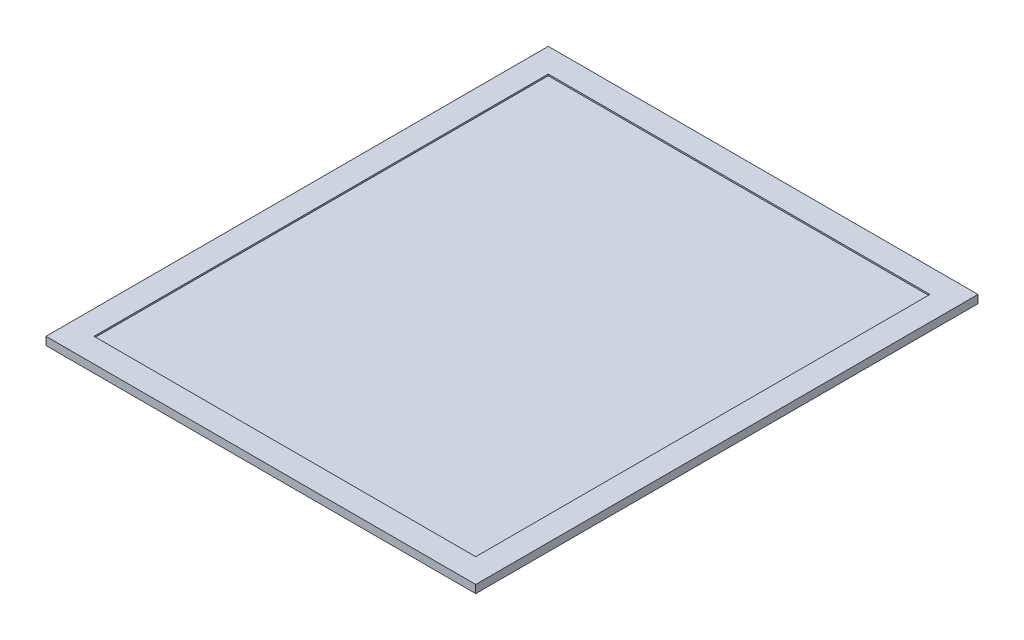
ISO-10303-21;
HEADER;
FILE_DESCRIPTION(('STEP AP214'),'2;1');
FILE_NAME('part.step','',(''),(''),'','','');
FILE_SCHEMA(('AUTOMOTIVE_DESIGN { 1 0 10303 214 1 1 1 1 }'));
ENDSEC;
DATA;
#1=APPLICATION_CONTEXT('core data for automotive mechanical design processes');
#2=APPLICATION_PROTOCOL_DEFINITION('international standard','automotive_design',2000,#1);
#3=PRODUCT_CONTEXT('',#1,'mechanical');
#4=PRODUCT('Part','Part','',(#3));
#5=PRODUCT_RELATED_PRODUCT_CATEGORY('part','',(#4));
#6=PRODUCT_DEFINITION_FORMATION('','',#4);
#7=PRODUCT_DEFINITION_CONTEXT('part definition',#1,'design');
#8=PRODUCT_DEFINITION('design','',#6,#7);
#9=PRODUCT_DEFINITION_SHAPE('','',#8);
#10=(LENGTH_UNIT() NAMED_UNIT(*) SI_UNIT(.MILLI.,.METRE.));
#11=(NAMED_UNIT(*) PLANE_ANGLE_UNIT() SI_UNIT($,.RADIAN.));
#12=(NAMED_UNIT(*) SI_UNIT($,.STERADIAN.) SOLID_ANGLE_UNIT());
#13=UNCERTAINTY_MEASURE_WITH_UNIT(LENGTH_MEASURE(1.E-05),#10,'distance_accuracy_value','');
#14=(GEOMETRIC_REPRESENTATION_CONTEXT(3) GLOBAL_UNCERTAINTY_ASSIGNED_CONTEXT((#13)) GLOBAL_UNIT_ASSIGNED_CONTEXT((#10,
#11,#12)) REPRESENTATION_CONTEXT('',''));
#15=CARTESIAN_POINT('',(0.,0.,0.));
#16=DIRECTION('',(0.,0.,1.));
#17=DIRECTION('',(1.,0.,0.));
#18=AXIS2_PLACEMENT_3D('',#15,#16,#17);
#19=CARTESIAN_POINT('',(192.5,-1084.5,1285.));
#20=DIRECTION('',(0.,1.,0.));
#21=DIRECTION('',(-1.,0.,0.));
#22=AXIS2_PLACEMENT_3D('',#19,#20,#21);
#23=PLANE('',#22);
#24=DIRECTION('',(1.,0.,0.));
#25=VECTOR('',#24,1.);
#26=CARTESIAN_POINT('',(-237.,-1084.5,1787.));
#27=LINE('',#26,#25);
#28=CARTESIAN_POINT('',(-237.,-1084.5,1787.));
#29=VERTEX_POINT('',#28);
#30=CARTESIAN_POINT('',(622.,-1084.5,1787.));
#31=VERTEX_POINT('',#30);
#32=EDGE_CURVE('E77',#29,#31,#27,.T.);
#33=ORIENTED_EDGE('',*,*,#32,.F.);
#34=DIRECTION('',(0.,0.,1.));
#35=VECTOR('',#34,1.);
#36=CARTESIAN_POINT('',(-237.,-1084.5,783.));
#37=LINE('',#36,#35);
#38=CARTESIAN_POINT('',(-237.,-1084.5,783.));
#39=VERTEX_POINT('',#38);
#40=EDGE_CURVE('E36',#39,#29,#37,.T.);
#41=ORIENTED_EDGE('',*,*,#40,.F.);
#42=DIRECTION('',(-1.,0.,0.));
#43=VECTOR('',#42,1.);
#44=CARTESIAN_POINT('',(622.,-1084.5,783.));
#45=LINE('',#44,#43);
#46=CARTESIAN_POINT('',(622.,-1084.5,783.));
#47=VERTEX_POINT('',#46);
#48=EDGE_CURVE('E81',#47,#39,#45,.T.);
#49=ORIENTED_EDGE('',*,*,#48,.F.);
#50=DIRECTION('',(0.,0.,-1.));
#51=VECTOR('',#50,1.);
#52=CARTESIAN_POINT('',(622.,-1084.5,1787.));
#53=LINE('',#52,#51);
#54=EDGE_CURVE('E27',#31,#47,#53,.T.);
#55=ORIENTED_EDGE('',*,*,#54,.F.);
#56=EDGE_LOOP('',(#33,#41,#49,#55));
#57=FACE_BOUND('',#56,.T.);
#58=ADVANCED_FACE('F17',(#57),#23,.F.);
#59=CARTESIAN_POINT('',(622.,-1084.5,1787.));
#60=DIRECTION('',(1.,0.,0.));
#61=DIRECTION('',(0.,1.,0.));
#62=AXIS2_PLACEMENT_3D('',#59,#60,#61);
#63=PLANE('',#62);
#64=DIRECTION('',(0.,1.,0.));
#65=VECTOR('',#64,1.);
#66=CARTESIAN_POINT('',(622.,-1084.5,783.));
#67=LINE('',#66,#65);
#68=CARTESIAN_POINT('',(622.,-1068.5,783.));
#69=VERTEX_POINT('',#68);
#70=EDGE_CURVE('E11',#47,#69,#67,.T.);
#71=ORIENTED_EDGE('',*,*,#70,.T.);
#72=DIRECTION('',(0.,0.,-1.));
#73=VECTOR('',#72,1.);
#74=CARTESIAN_POINT('',(622.,-1068.5,1787.));
#75=LINE('',#74,#73);
#76=CARTESIAN_POINT('',(622.,-1068.5,1787.));
#77=VERTEX_POINT('',#76);
#78=EDGE_CURVE('E137',#77,#69,#75,.T.);
#79=ORIENTED_EDGE('',*,*,#78,.F.);
#80=DIRECTION('',(0.,1.,0.));
#81=VECTOR('',#80,1.);
#82=CARTESIAN_POINT('',(622.,-1084.5,1787.));
#83=LINE('',#82,#81);
#84=EDGE_CURVE('E119',#31,#77,#83,.T.);
#85=ORIENTED_EDGE('',*,*,#84,.F.);
#86=ORIENTED_EDGE('',*,*,#54,.T.);
#87=EDGE_LOOP('',(#71,#79,#85,#86));
#88=FACE_BOUND('',#87,.T.);
#89=ADVANCED_FACE('F171',(#88),#63,.T.);
#90=CARTESIAN_POINT('',(-237.,-1084.5,1787.));
#91=DIRECTION('',(0.,0.,1.));
#92=DIRECTION('',(-1.,0.,0.));
#93=AXIS2_PLACEMENT_3D('',#90,#91,#92);
#94=PLANE('',#93);
#95=ORIENTED_EDGE('',*,*,#84,.T.);
#96=DIRECTION('',(1.,0.,0.));
#97=VECTOR('',#96,1.);
#98=CARTESIAN_POINT('',(-237.,-1068.5,1787.));
#99=LINE('',#98,#97);
#100=CARTESIAN_POINT('',(-237.,-1068.5,1787.));
#101=VERTEX_POINT('',#100);
#102=EDGE_CURVE('E134',#101,#77,#99,.T.);
#103=ORIENTED_EDGE('',*,*,#102,.F.);
#104=DIRECTION('',(0.,1.,0.));
#105=VECTOR('',#104,1.);
#106=CARTESIAN_POINT('',(-237.,-1084.5,1787.));
#107=LINE('',#106,#105);
#108=EDGE_CURVE('E125',#29,#101,#107,.T.);
#109=ORIENTED_EDGE('',*,*,#108,.F.);
#110=ORIENTED_EDGE('',*,*,#32,.T.);
#111=EDGE_LOOP('',(#95,#103,#109,#110));
#112=FACE_BOUND('',#111,.T.);
#113=ADVANCED_FACE('F176',(#112),#94,.T.);
#114=CARTESIAN_POINT('',(-237.,-1084.5,783.));
#115=DIRECTION('',(-1.,0.,0.));
#116=DIRECTION('',(0.,0.,1.));
#117=AXIS2_PLACEMENT_3D('',#114,#115,#116);
#118=PLANE('',#117);
#119=ORIENTED_EDGE('',*,*,#108,.T.);
#120=DIRECTION('',(0.,0.,1.));
#121=VECTOR('',#120,1.);
#122=CARTESIAN_POINT('',(-237.,-1068.5,783.));
#123=LINE('',#122,#121);
#124=CARTESIAN_POINT('',(-237.,-1068.5,783.));
#125=VERTEX_POINT('',#124);
#126=EDGE_CURVE('E136',#125,#101,#123,.T.);
#127=ORIENTED_EDGE('',*,*,#126,.F.);
#128=DIRECTION('',(0.,1.,0.));
#129=VECTOR('',#128,1.);
#130=CARTESIAN_POINT('',(-237.,-1084.5,783.));
#131=LINE('',#130,#129);
#132=EDGE_CURVE('E139',#39,#125,#131,.T.);
#133=ORIENTED_EDGE('',*,*,#132,.F.);
#134=ORIENTED_EDGE('',*,*,#40,.T.);
#135=EDGE_LOOP('',(#119,#127,#133,#134));
#136=FACE_BOUND('',#135,.T.);
#137=ADVANCED_FACE('F181',(#136),#118,.T.);
#138=CARTESIAN_POINT('',(622.,-1084.5,783.));
#139=DIRECTION('',(0.,0.,-1.));
#140=DIRECTION('',(0.,-1.,0.));
#141=AXIS2_PLACEMENT_3D('',#138,#139,#140);
#142=PLANE('',#141);
#143=ORIENTED_EDGE('',*,*,#132,.T.);
#144=DIRECTION('',(-1.,0.,0.));
#145=VECTOR('',#144,1.);
#146=CARTESIAN_POINT('',(622.,-1068.5,783.));
#147=LINE('',#146,#145);
#148=EDGE_CURVE('E129',#69,#125,#147,.T.);
#149=ORIENTED_EDGE('',*,*,#148,.F.);
#150=ORIENTED_EDGE('',*,*,#70,.F.);
#151=ORIENTED_EDGE('',*,*,#48,.T.);
#152=EDGE_LOOP('',(#143,#149,#150,#151));
#153=FACE_BOUND('',#152,.T.);
#154=ADVANCED_FACE('F166',(#153),#142,.T.);
#155=CARTESIAN_POINT('',(192.5,-1068.5,1285.));
#156=DIRECTION('',(0.,1.,0.));
#157=DIRECTION('',(-1.,0.,0.));
#158=AXIS2_PLACEMENT_3D('',#155,#156,#157);
#159=PLANE('',#158);
#160=ORIENTED_EDGE('',*,*,#148,.T.);
#161=ORIENTED_EDGE('',*,*,#126,.T.);
#162=ORIENTED_EDGE('',*,*,#102,.T.);
#163=ORIENTED_EDGE('',*,*,#78,.T.);
#164=EDGE_LOOP('',(#160,#161,#162,#163));
#165=FACE_BOUND('',#164,.T.);
#166=DIRECTION('',(1.,0.,0.));
#167=VECTOR('',#166,1.);
#168=CARTESIAN_POINT('',(-189.,-1068.5,1739.));
#169=LINE('',#168,#167);
#170=CARTESIAN_POINT('',(-189.,-1068.5,1739.));
#171=VERTEX_POINT('',#170);
#172=CARTESIAN_POINT('',(574.,-1068.5,1739.));
#173=VERTEX_POINT('',#172);
#174=EDGE_CURVE('E106',#171,#173,#169,.T.);
#175=ORIENTED_EDGE('',*,*,#174,.F.);
#176=DIRECTION('',(0.,0.,1.));
#177=VECTOR('',#176,1.);
#178=CARTESIAN_POINT('',(-189.,-1068.5,831.));
#179=LINE('',#178,#177);
#180=CARTESIAN_POINT('',(-189.,-1068.5,831.));
#181=VERTEX_POINT('',#180);
#182=EDGE_CURVE('E104',#181,#171,#179,.T.);
#183=ORIENTED_EDGE('',*,*,#182,.F.);
#184=DIRECTION('',(-1.,0.,0.));
#185=VECTOR('',#184,1.);
#186=CARTESIAN_POINT('',(574.,-1068.5,831.));
#187=LINE('',#186,#185);
#188=CARTESIAN_POINT('',(574.,-1068.5,831.));
#189=VERTEX_POINT('',#188);
#190=EDGE_CURVE('E89',#189,#181,#187,.T.);
#191=ORIENTED_EDGE('',*,*,#190,.F.);
#192=DIRECTION('',(0.,0.,-1.));
#193=VECTOR('',#192,1.);
#194=CARTESIAN_POINT('',(574.,-1068.5,1739.));
#195=LINE('',#194,#193);
#196=EDGE_CURVE('E146',#173,#189,#195,.T.);
#197=ORIENTED_EDGE('',*,*,#196,.F.);
#198=EDGE_LOOP('',(#175,#183,#191,#197));
#199=FACE_BOUND('',#198,.T.);
#200=ADVANCED_FACE('F105',(#165,#199),#159,.T.);
#201=CARTESIAN_POINT('',(574.,-1068.5,1739.));
#202=DIRECTION('',(1.,0.,0.));
#203=DIRECTION('',(0.,1.,0.));
#204=AXIS2_PLACEMENT_3D('',#201,#202,#203);
#205=PLANE('',#204);
#206=DIRECTION('',(0.,-1.,0.));
#207=VECTOR('',#206,1.);
#208=CARTESIAN_POINT('',(574.,-1068.5,831.));
#209=LINE('',#208,#207);
#210=CARTESIAN_POINT('',(574.,-1071.5,831.));
#211=VERTEX_POINT('',#210);
#212=EDGE_CURVE('E100',#189,#211,#209,.T.);
#213=ORIENTED_EDGE('',*,*,#212,.T.);
#214=DIRECTION('',(0.,0.,-1.));
#215=VECTOR('',#214,1.);
#216=CARTESIAN_POINT('',(574.,-1071.5,1739.));
#217=LINE('',#216,#215);
#218=CARTESIAN_POINT('',(574.,-1071.5,1739.));
#219=VERTEX_POINT('',#218);
#220=EDGE_CURVE('E21',#219,#211,#217,.T.);
#221=ORIENTED_EDGE('',*,*,#220,.F.);
#222=DIRECTION('',(0.,-1.,0.));
#223=VECTOR('',#222,1.);
#224=CARTESIAN_POINT('',(574.,-1068.5,1739.));
#225=LINE('',#224,#223);
#226=EDGE_CURVE('E117',#173,#219,#225,.T.);
#227=ORIENTED_EDGE('',*,*,#226,.F.);
#228=ORIENTED_EDGE('',*,*,#196,.T.);
#229=EDGE_LOOP('',(#213,#221,#227,#228));
#230=FACE_BOUND('',#229,.T.);
#231=ADVANCED_FACE('F157',(#230),#205,.F.);
#232=CARTESIAN_POINT('',(-189.,-1068.5,1739.));
#233=DIRECTION('',(0.,0.,1.));
#234=DIRECTION('',(-1.,0.,0.));
#235=AXIS2_PLACEMENT_3D('',#232,#233,#234);
#236=PLANE('',#235);
#237=ORIENTED_EDGE('',*,*,#226,.T.);
#238=DIRECTION('',(1.,0.,0.));
#239=VECTOR('',#238,1.);
#240=CARTESIAN_POINT('',(-189.,-1071.5,1739.));
#241=LINE('',#240,#239);
#242=CARTESIAN_POINT('',(-189.,-1071.5,1739.));
#243=VERTEX_POINT('',#242);
#244=EDGE_CURVE('E131',#243,#219,#241,.T.);
#245=ORIENTED_EDGE('',*,*,#244,.F.);
#246=DIRECTION('',(0.,-1.,0.));
#247=VECTOR('',#246,1.);
#248=CARTESIAN_POINT('',(-189.,-1068.5,1739.));
#249=LINE('',#248,#247);
#250=EDGE_CURVE('E110',#171,#243,#249,.T.);
#251=ORIENTED_EDGE('',*,*,#250,.F.);
#252=ORIENTED_EDGE('',*,*,#174,.T.);
#253=EDGE_LOOP('',(#237,#245,#251,#252));
#254=FACE_BOUND('',#253,.T.);
#255=ADVANCED_FACE('F159',(#254),#236,.F.);
#256=CARTESIAN_POINT('',(-189.,-1068.5,831.));
#257=DIRECTION('',(-1.,0.,0.));
#258=DIRECTION('',(0.,0.,1.));
#259=AXIS2_PLACEMENT_3D('',#256,#257,#258);
#260=PLANE('',#259);
#261=ORIENTED_EDGE('',*,*,#250,.T.);
#262=DIRECTION('',(0.,0.,1.));
#263=VECTOR('',#262,1.);
#264=CARTESIAN_POINT('',(-189.,-1071.5,831.));
#265=LINE('',#264,#263);
#266=CARTESIAN_POINT('',(-189.,-1071.5,831.));
#267=VERTEX_POINT('',#266);
#268=EDGE_CURVE('E113',#267,#243,#265,.T.);
#269=ORIENTED_EDGE('',*,*,#268,.F.);
#270=DIRECTION('',(0.,-1.,0.));
#271=VECTOR('',#270,1.);
#272=CARTESIAN_POINT('',(-189.,-1068.5,831.));
#273=LINE('',#272,#271);
#274=EDGE_CURVE('E97',#181,#267,#273,.T.);
#275=ORIENTED_EDGE('',*,*,#274,.F.);
#276=ORIENTED_EDGE('',*,*,#182,.T.);
#277=EDGE_LOOP('',(#261,#269,#275,#276));
#278=FACE_BOUND('',#277,.T.);
#279=ADVANCED_FACE('F19',(#278),#260,.F.);
#280=CARTESIAN_POINT('',(574.,-1068.5,831.));
#281=DIRECTION('',(0.,0.,-1.));
#282=DIRECTION('',(0.,-1.,0.));
#283=AXIS2_PLACEMENT_3D('',#280,#281,#282);
#284=PLANE('',#283);
#285=ORIENTED_EDGE('',*,*,#274,.T.);
#286=DIRECTION('',(-1.,0.,0.));
#287=VECTOR('',#286,1.);
#288=CARTESIAN_POINT('',(574.,-1071.5,831.));
#289=LINE('',#288,#287);
#290=EDGE_CURVE('E101',#211,#267,#289,.T.);
#291=ORIENTED_EDGE('',*,*,#290,.F.);
#292=ORIENTED_EDGE('',*,*,#212,.F.);
#293=ORIENTED_EDGE('',*,*,#190,.T.);
#294=EDGE_LOOP('',(#285,#291,#292,#293));
#295=FACE_BOUND('',#294,.T.);
#296=ADVANCED_FACE('F94',(#295),#284,.F.);
#297=CARTESIAN_POINT('',(192.5,-1071.5,1285.));
#298=DIRECTION('',(0.,1.,0.));
#299=DIRECTION('',(-1.,0.,0.));
#300=AXIS2_PLACEMENT_3D('',#297,#298,#299);
#301=PLANE('',#300);
#302=ORIENTED_EDGE('',*,*,#290,.T.);
#303=ORIENTED_EDGE('',*,*,#268,.T.);
#304=ORIENTED_EDGE('',*,*,#244,.T.);
#305=ORIENTED_EDGE('',*,*,#220,.T.);
#306=EDGE_LOOP('',(#302,#303,#304,#305));
#307=FACE_BOUND('',#306,.T.);
#308=ADVANCED_FACE('F155',(#307),#301,.T.);
#309=CLOSED_SHELL('',(#58,#89,#113,#137,#154,#200,#231,#255,#279,#296,#308));
#310=MANIFOLD_SOLID_BREP('B1',#309);
#311=ADVANCED_BREP_SHAPE_REPRESENTATION('',(#18,#310),#14);
#312=SHAPE_DEFINITION_REPRESENTATION(#9,#311);
ENDSEC;
END-ISO-10303-21;
